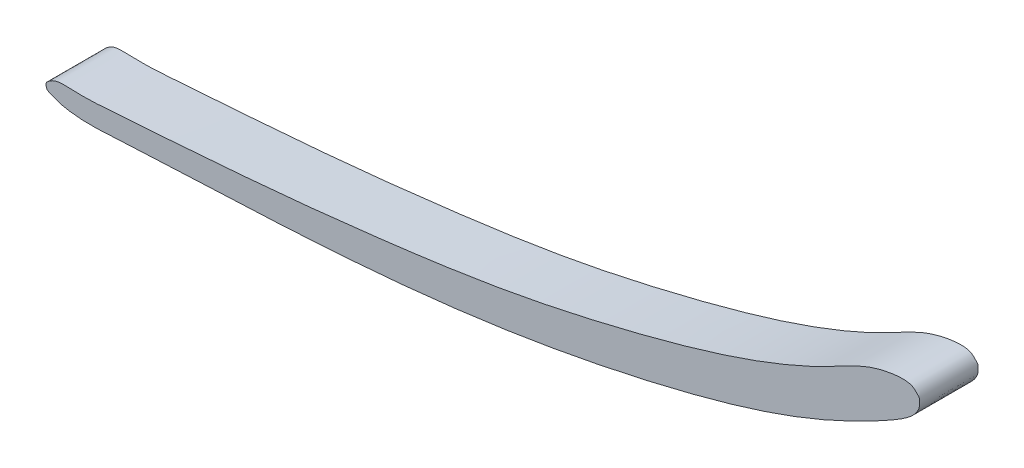
ISO-10303-21;
HEADER;
FILE_DESCRIPTION(('STEP AP214'),'2;1');
FILE_NAME('part.step','',(''),(''),'','','');
FILE_SCHEMA(('AUTOMOTIVE_DESIGN { 1 0 10303 214 1 1 1 1 }'));
ENDSEC;
DATA;
#1=APPLICATION_CONTEXT('core data for automotive mechanical design processes');
#2=APPLICATION_PROTOCOL_DEFINITION('international standard','automotive_design',2000,#1);
#3=PRODUCT_CONTEXT('',#1,'mechanical');
#4=PRODUCT('Part','Part','',(#3));
#5=PRODUCT_RELATED_PRODUCT_CATEGORY('part','',(#4));
#6=PRODUCT_DEFINITION_FORMATION('','',#4);
#7=PRODUCT_DEFINITION_CONTEXT('part definition',#1,'design');
#8=PRODUCT_DEFINITION('design','',#6,#7);
#9=PRODUCT_DEFINITION_SHAPE('','',#8);
#10=(LENGTH_UNIT() NAMED_UNIT(*) SI_UNIT(.MILLI.,.METRE.));
#11=(NAMED_UNIT(*) PLANE_ANGLE_UNIT() SI_UNIT($,.RADIAN.));
#12=(NAMED_UNIT(*) SI_UNIT($,.STERADIAN.) SOLID_ANGLE_UNIT());
#13=UNCERTAINTY_MEASURE_WITH_UNIT(LENGTH_MEASURE(1.E-05),#10,'distance_accuracy_value','');
#14=(GEOMETRIC_REPRESENTATION_CONTEXT(3) GLOBAL_UNCERTAINTY_ASSIGNED_CONTEXT((#13)) GLOBAL_UNIT_ASSIGNED_CONTEXT((#10,
#11,#12)) REPRESENTATION_CONTEXT('',''));
#15=CARTESIAN_POINT('',(0.,0.,0.));
#16=DIRECTION('',(0.,0.,1.));
#17=DIRECTION('',(1.,0.,0.));
#18=AXIS2_PLACEMENT_3D('',#15,#16,#17);
#19=CARTESIAN_POINT('',(65.9642108169921,0.,388.));
#20=CARTESIAN_POINT('',(65.9392604277968,0.0787500690966614,388.));
#21=CARTESIAN_POINT('',(65.8874789664315,0.142846440213562,388.));
#22=CARTESIAN_POINT('',(65.7787320444733,0.264169227618044,388.));
#23=CARTESIAN_POINT('',(65.7207722300646,0.321384266652125,388.));
#24=CARTESIAN_POINT('',(65.5503656062692,0.496366636395962,388.));
#25=CARTESIAN_POINT('',(65.4377078271482,0.615289117925799,388.));
#26=CARTESIAN_POINT('',(65.2517296303627,0.771103452941152,388.));
#27=CARTESIAN_POINT('',(65.1874278544465,0.819707672533615,388.));
#28=CARTESIAN_POINT('',(65.0503069560082,0.904618416811304,388.));
#29=CARTESIAN_POINT('',(64.9772650788789,0.941289962653219,388.));
#30=CARTESIAN_POINT('',(64.7497811757064,1.03476083895088,388.));
#31=CARTESIAN_POINT('',(64.5926836151299,1.07331051921819,388.));
#32=CARTESIAN_POINT('',(64.2731707278348,1.1271865497105,388.));
#33=CARTESIAN_POINT('',(64.1100919216247,1.14193842680402,388.));
#34=CARTESIAN_POINT('',(63.7865768692738,1.15870800268766,388.));
#35=CARTESIAN_POINT('',(63.6252966356052,1.16061833902611,388.));
#36=CARTESIAN_POINT('',(63.1427335001329,1.14901922847191,388.));
#37=CARTESIAN_POINT('',(62.82264224002,1.11934521510709,388.));
#38=CARTESIAN_POINT('',(61.8646438577998,0.999457500857559,388.));
#39=CARTESIAN_POINT('',(61.2275957134184,0.873139458770184,388.));
#40=CARTESIAN_POINT('',(59.9868023955705,0.553958505213503,388.));
#41=CARTESIAN_POINT('',(59.3799039791273,0.358589748207488,388.));
#42=CARTESIAN_POINT('',(57.5974899847509,-0.328984359762002,388.));
#43=CARTESIAN_POINT('',(56.457602278,-0.916521848918717,388.));
#44=CARTESIAN_POINT('',(54.7565709667037,-1.81802494333191,388.));
#45=CARTESIAN_POINT('',(54.1905511029622,-2.12074540468735,388.));
#46=CARTESIAN_POINT('',(53.0525663749559,-2.71286625198194,388.));
#47=CARTESIAN_POINT('',(52.481226933694,-3.00366792990275,388.));
#48=CARTESIAN_POINT('',(50.7544214755258,-3.8474227400587,388.));
#49=CARTESIAN_POINT('',(49.5860213532244,-4.37139635267325,388.));
#50=CARTESIAN_POINT('',(47.2258537122776,-5.36698774035979,388.));
#51=CARTESIAN_POINT('',(46.034288975709,-5.83905985896721,388.));
#52=CARTESIAN_POINT('',(43.634443150405,-6.74575026069812,388.));
#53=CARTESIAN_POINT('',(42.4253581999058,-7.17975742257679,388.));
#54=CARTESIAN_POINT('',(39.99473578518,-8.0060430000595,388.));
#55=CARTESIAN_POINT('',(38.7728594737219,-8.39915359601567,388.));
#56=CARTESIAN_POINT('',(35.0918972791923,-9.53169879542995,388.));
#57=CARTESIAN_POINT('',(32.6200875942023,-10.2266081639388,388.));
#58=CARTESIAN_POINT('',(27.6590940123018,-11.5446994014282,388.));
#59=CARTESIAN_POINT('',(25.1681659412895,-12.1651334390557,388.));
#60=CARTESIAN_POINT('',(20.1696456645858,-13.3403093937647,388.));
#61=CARTESIAN_POINT('',(17.6638962520581,-13.8968119730028,388.));
#62=CARTESIAN_POINT('',(12.6351066276134,-14.9269894733759,388.));
#63=CARTESIAN_POINT('',(10.1106438461161,-15.3978194880559,388.));
#64=CARTESIAN_POINT('',(5.04705965641873,-16.2485879920392,388.));
#65=CARTESIAN_POINT('',(2.50859634852263,-16.6291947143201,388.));
#66=CARTESIAN_POINT('',(-2.57688899399253,-17.3329615389946,388.));
#67=CARTESIAN_POINT('',(-5.12368892729978,-17.6588430807766,388.));
#68=CARTESIAN_POINT('',(-12.7690520579369,-18.5881322254008,388.));
#69=CARTESIAN_POINT('',(-17.8749794132735,-19.1358117771888,388.));
#70=CARTESIAN_POINT('',(-28.1023034658038,-20.0562887004946,388.));
#71=CARTESIAN_POINT('',(-33.2228827851277,-20.4376817382285,388.));
#72=CARTESIAN_POINT('',(-39.6237509954103,-20.9093219874368,388.));
#73=CARTESIAN_POINT('',(-40.9039962840792,-21.002676829007,388.));
#74=CARTESIAN_POINT('',(-42.824766919896,-21.1370946502369,388.));
#75=CARTESIAN_POINT('',(-43.4651186699146,-21.180506652422,388.));
#76=CARTESIAN_POINT('',(-44.7458493129552,-21.2669067002644,388.));
#77=CARTESIAN_POINT('',(-45.3862325038984,-21.3110553944028,388.));
#78=CARTESIAN_POINT('',(-46.6675302142903,-21.3859859680086,388.));
#79=CARTESIAN_POINT('',(-47.3082343394681,-21.4163645469563,388.));
#80=CARTESIAN_POINT('',(-48.2695280474722,-21.4314776101353,388.));
#81=CARTESIAN_POINT('',(-48.5899931851929,-21.4321684250537,388.));
#82=CARTESIAN_POINT('',(-49.2310083883098,-21.422660642521,388.));
#83=CARTESIAN_POINT('',(-49.5515695342703,-21.4110412969346,388.));
#84=CARTESIAN_POINT('',(-50.1927239762963,-21.3836803246825,388.));
#85=CARTESIAN_POINT('',(-50.5135086932717,-21.370385869251,388.));
#86=CARTESIAN_POINT('',(-51.1539205751515,-21.3728740146693,388.));
#87=CARTESIAN_POINT('',(-51.4731612822713,-21.3851335782777,388.));
#88=CARTESIAN_POINT('',(-51.9467576939098,-21.4636044214519,388.));
#89=CARTESIAN_POINT('',(-52.105175905584,-21.5009809380998,388.));
#90=CARTESIAN_POINT('',(-52.4054652955935,-21.6056828948007,388.));
#91=CARTESIAN_POINT('',(-52.5475806572714,-21.6745987471624,388.));
#92=CARTESIAN_POINT('',(-52.819883737945,-21.83703771257,388.));
#93=CARTESIAN_POINT('',(-52.9512682536261,-21.9293075929916,388.));
#94=CARTESIAN_POINT('',(-53.1420580882683,-22.0750081789947,388.));
#95=CARTESIAN_POINT('',(-53.2071720058634,-22.121802219078,388.));
#96=CARTESIAN_POINT('',(-53.2948585143602,-22.2036590247301,388.));
#97=CARTESIAN_POINT('',(-53.3220673665442,-22.2334103186364,388.));
#98=CARTESIAN_POINT('',(-53.3674465063147,-22.3030474090628,388.));
#99=CARTESIAN_POINT('',(-53.3844573084682,-22.3402893587864,388.));
#100=CARTESIAN_POINT('',(-53.4210639936985,-22.4581713600573,388.));
#101=CARTESIAN_POINT('',(-53.4219354782649,-22.542680595509,388.));
#102=CARTESIAN_POINT('',(-53.4032851978629,-22.7061575054446,388.));
#103=CARTESIAN_POINT('',(-53.3901634459533,-22.787192590055,388.));
#104=CARTESIAN_POINT('',(-53.3481176763658,-22.9463351895977,388.));
#105=CARTESIAN_POINT('',(-53.3174422641806,-23.0250371022844,388.));
#106=CARTESIAN_POINT('',(-53.2128913009128,-23.1539721411735,388.));
#107=CARTESIAN_POINT('',(-53.1392758572465,-23.1959191877526,388.));
#108=CARTESIAN_POINT('',(-52.9891963089232,-23.2619574052381,388.));
#109=CARTESIAN_POINT('',(-52.9114871441464,-23.2886399913511,388.));
#110=CARTESIAN_POINT('',(-52.7584537212832,-23.3476663864524,388.));
#111=CARTESIAN_POINT('',(-52.6824893940183,-23.3784715270879,388.));
#112=CARTESIAN_POINT('',(-52.4552152795412,-23.4729355145685,388.));
#113=CARTESIAN_POINT('',(-52.3050351147794,-23.539756873824,388.));
#114=CARTESIAN_POINT('',(-51.8501097024749,-23.7275991417051,388.));
#115=CARTESIAN_POINT('',(-51.5376922777435,-23.8265359973429,388.));
#116=CARTESIAN_POINT('',(-50.8992249330776,-23.9851691203188,388.));
#117=CARTESIAN_POINT('',(-50.5756264503499,-24.0472311719441,388.));
#118=CARTESIAN_POINT('',(-49.6073783965635,-24.2035447785117,388.));
#119=CARTESIAN_POINT('',(-48.9593340099133,-24.2620406718818,388.));
#120=CARTESIAN_POINT('',(-47.6596318360921,-24.3141461601518,388.));
#121=CARTESIAN_POINT('',(-47.0080994304757,-24.3100072477715,388.));
#122=CARTESIAN_POINT('',(-45.7037182013001,-24.2780903364879,388.));
#123=CARTESIAN_POINT('',(-45.0507095812287,-24.248663170275,388.));
#124=CARTESIAN_POINT('',(-43.7458312021009,-24.182566121625,388.));
#125=CARTESIAN_POINT('',(-43.0935952790582,-24.1455760691589,388.));
#126=CARTESIAN_POINT('',(-41.1369581776411,-24.0331975163158,388.));
#127=CARTESIAN_POINT('',(-39.8324949729532,-23.9590588798067,388.));
#128=CARTESIAN_POINT('',(-35.9180997533741,-23.757042369718,388.));
#129=CARTESIAN_POINT('',(-33.3072606674215,-23.6475851612079,388.));
#130=CARTESIAN_POINT('',(-28.0855986870327,-23.4282444992524,388.));
#131=CARTESIAN_POINT('',(-25.4748830123288,-23.316535036285,388.));
#132=CARTESIAN_POINT('',(-17.6458860622312,-22.9257036654572,388.));
#133=CARTESIAN_POINT('',(-12.4295110950171,-22.591215585468,388.));
#134=CARTESIAN_POINT('',(-2.01680300936645,-21.6669805567166,388.));
#135=CARTESIAN_POINT('',(3.1792578141617,-21.0819564507359,388.));
#136=CARTESIAN_POINT('',(13.5246956704272,-19.5881773945117,388.));
#137=CARTESIAN_POINT('',(18.6737714437003,-18.6760127034812,388.));
#138=CARTESIAN_POINT('',(26.3501491609859,-17.0792677310921,388.));
#139=CARTESIAN_POINT('',(28.9002388250499,-16.5104169154326,388.));
#140=CARTESIAN_POINT('',(33.9803763134568,-15.2884237762731,388.));
#141=CARTESIAN_POINT('',(36.5117533185728,-14.6364326828999,388.));
#142=CARTESIAN_POINT('',(41.5413423081267,-13.2132112328842,388.));
#143=CARTESIAN_POINT('',(44.0372903688327,-12.4416906526706,388.));
#144=CARTESIAN_POINT('',(48.9724920757394,-10.7184268489999,388.));
#145=CARTESIAN_POINT('',(51.4071911168036,-9.76394180389986,388.));
#146=CARTESIAN_POINT('',(56.1867315518084,-7.64243805906259,388.));
#147=CARTESIAN_POINT('',(58.5289057440696,-6.47676745576864,388.));
#148=CARTESIAN_POINT('',(61.4033144476391,-4.92102218939242,388.));
#149=CARTESIAN_POINT('',(61.9755573398296,-4.60484101236053,388.));
#150=CARTESIAN_POINT('',(62.822925427624,-4.1117018035465,388.));
#151=CARTESIAN_POINT('',(63.1034353929833,-3.94347540791767,388.));
#152=CARTESIAN_POINT('',(63.6559349386653,-3.59454338285464,388.));
#153=CARTESIAN_POINT('',(63.9282731320078,-3.41469241372927,388.));
#154=CARTESIAN_POINT('',(64.4554233597097,-3.03086272723407,388.));
#155=CARTESIAN_POINT('',(64.7106229543283,-2.82642774874983,388.));
#156=CARTESIAN_POINT('',(65.1877516413519,-2.37589238285399,388.));
#157=CARTESIAN_POINT('',(65.406209750067,-2.13062618732443,388.));
#158=CARTESIAN_POINT('',(65.6839775847032,-1.7246065887864,388.));
#159=CARTESIAN_POINT('',(65.7675452095348,-1.58442769692943,388.));
#160=CARTESIAN_POINT('',(65.9039115038873,-1.28756609085134,388.));
#161=CARTESIAN_POINT('',(65.9573363126952,-1.12825620227153,388.));
#162=CARTESIAN_POINT('',(66.0005625001609,-0.808906264520487,388.));
#163=CARTESIAN_POINT('',(65.9911672667361,-0.646725418918664,388.));
#164=CARTESIAN_POINT('',(65.9816128321958,-0.403820913610242,388.));
#165=CARTESIAN_POINT('',(65.9821578723777,-0.322953588910407,388.));
#166=CARTESIAN_POINT('',(65.984764845854,-0.160965703927929,388.));
#167=CARTESIAN_POINT('',(65.9891612061873,-0.0787500690966336,388.));
#168=CARTESIAN_POINT('',(65.9642108169921,0.,388.));
#169=B_SPLINE_CURVE_WITH_KNOTS('',3,(#19,#20,#21,#22,#23,#24,#25,#26,#27,#28,#29,#30,#31,#32,
#33,#34,#35,#36,#37,#38,#39,#40,#41,#42,#43,#44,#45,#46,#47,#48,#49,#50,#51,#52,#53,#54,#55,#56,
#57,#58,#59,#60,#61,#62,#63,#64,#65,#66,#67,#68,#69,#70,#71,#72,#73,#74,#75,#76,#77,#78,#79,#80,
#81,#82,#83,#84,#85,#86,#87,#88,#89,#90,#91,#92,#93,#94,#95,#96,#97,#98,#99,#100,#101,#102,#103,
#104,#105,#106,#107,#108,#109,#110,#111,#112,#113,#114,#115,#116,#117,#118,#119,#120,#121,#122,
#123,#124,#125,#126,#127,#128,#129,#130,#131,#132,#133,#134,#135,#136,#137,#138,#139,#140,#141,
#142,#143,#144,#145,#146,#147,#148,#149,#150,#151,#152,#153,#154,#155,#156,#157,#158,#159,#160,
#161,#162,#163,#164,#165,#166,#167,#168),.UNSPECIFIED.,.T.,.F.,(4,2,2,2,2,2,2,2,2,2,2,2,2,2,2,2,
2,2,2,2,2,2,2,2,2,2,2,2,2,2,2,2,2,2,2,2,2,2,2,2,2,2,2,2,2,2,2,2,2,2,2,2,2,2,2,2,2,2,2,2,2,2,2,2,
2,2,2,2,2,2,2,2,2,2,4),(0.,0.00097656250000013,0.00195312500000026,0.0039062500000004,
0.00488281250000041,0.00585937500000042,0.00781250000000044,0.00976562500000046,
0.0117187500000005,0.0156250000000003,0.0234375000000001,0.0312499999999998,0.0468749999999993,
0.054687499999999,0.0624999999999987,0.0781249999999981,0.0937499999999975,0.109374999999997,
0.124999999999996,0.156249999999995,0.187499999999994,0.218749999999993,0.249999999999991,
0.28124999999999,0.312499999999989,0.374999999999986,0.437499999999984,0.453124999999983,
0.460937499999983,0.468749999999983,0.476562499999982,0.480468749999982,0.484374999999982,
0.488281249999982,0.492187499999982,0.494140624999982,0.496093749999982,0.498046874999982,
0.499023437499982,0.499511718749982,0.499999999999982,0.500976562499982,0.501953124999982,
0.502929687499982,0.503906249999982,0.504882812499982,0.505859374999982,0.507812499999982,
0.511718749999982,0.515624999999982,0.523437499999982,0.531249999999983,0.539062499999983,
0.546874999999983,0.562499999999984,0.593749999999985,0.624999999999986,0.687499999999988,
0.749999999999991,0.812499999999993,0.843749999999994,0.874999999999995,0.906249999999997,
0.937499999999998,0.968749999999999,0.976562499999999,0.980468749999999,0.984374999999999,
0.98828125,0.9921875,0.994140625,0.99609375,0.998046875,0.9990234375,1.),.UNSPECIFIED.);
#170=DIRECTION('',(0.,0.,-1.));
#171=VECTOR('',#170,1.);
#172=SURFACE_OF_LINEAR_EXTRUSION('',#169,#171);
#173=CARTESIAN_POINT('',(65.9642108169921,0.,388.));
#174=CARTESIAN_POINT('',(65.9891612061873,-0.0787500690966336,388.));
#175=CARTESIAN_POINT('',(65.984764845854,-0.160965703927929,388.));
#176=CARTESIAN_POINT('',(65.9821578723777,-0.322953588910407,388.));
#177=CARTESIAN_POINT('',(65.9816128321958,-0.403820913610242,388.));
#178=CARTESIAN_POINT('',(65.9911672667361,-0.646725418918664,388.));
#179=CARTESIAN_POINT('',(66.0005625001609,-0.808906264520487,388.));
#180=CARTESIAN_POINT('',(65.9573363126952,-1.12825620227153,388.));
#181=CARTESIAN_POINT('',(65.9039115038873,-1.28756609085134,388.));
#182=CARTESIAN_POINT('',(65.7675452095348,-1.58442769692943,388.));
#183=CARTESIAN_POINT('',(65.6839775847032,-1.7246065887864,388.));
#184=CARTESIAN_POINT('',(65.406209750067,-2.13062618732443,388.));
#185=CARTESIAN_POINT('',(65.1877516413519,-2.37589238285399,388.));
#186=CARTESIAN_POINT('',(64.7106229543283,-2.82642774874983,388.));
#187=CARTESIAN_POINT('',(64.4554233597097,-3.03086272723407,388.));
#188=CARTESIAN_POINT('',(63.9282731320078,-3.41469241372927,388.));
#189=CARTESIAN_POINT('',(63.6559349386653,-3.59454338285464,388.));
#190=CARTESIAN_POINT('',(63.1034353929833,-3.94347540791767,388.));
#191=CARTESIAN_POINT('',(62.822925427624,-4.1117018035465,388.));
#192=CARTESIAN_POINT('',(61.9755573398296,-4.60484101236053,388.));
#193=CARTESIAN_POINT('',(61.4033144476391,-4.92102218939242,388.));
#194=CARTESIAN_POINT('',(58.5289057440696,-6.47676745576864,388.));
#195=CARTESIAN_POINT('',(56.1867315518084,-7.64243805906259,388.));
#196=CARTESIAN_POINT('',(51.4071911168036,-9.76394180389986,388.));
#197=CARTESIAN_POINT('',(48.9724920757394,-10.7184268489999,388.));
#198=CARTESIAN_POINT('',(44.0372903688327,-12.4416906526706,388.));
#199=CARTESIAN_POINT('',(41.5413423081267,-13.2132112328842,388.));
#200=CARTESIAN_POINT('',(36.5117533185728,-14.6364326828999,388.));
#201=CARTESIAN_POINT('',(33.9803763134568,-15.2884237762731,388.));
#202=CARTESIAN_POINT('',(28.9002388250499,-16.5104169154326,388.));
#203=CARTESIAN_POINT('',(26.3501491609859,-17.0792677310921,388.));
#204=CARTESIAN_POINT('',(18.6737714437003,-18.6760127034812,388.));
#205=CARTESIAN_POINT('',(13.5246956704272,-19.5881773945117,388.));
#206=CARTESIAN_POINT('',(3.1792578141617,-21.0819564507359,388.));
#207=CARTESIAN_POINT('',(-2.01680300936645,-21.6669805567166,388.));
#208=CARTESIAN_POINT('',(-12.4295110950171,-22.591215585468,388.));
#209=CARTESIAN_POINT('',(-17.6458860622312,-22.9257036654572,388.));
#210=CARTESIAN_POINT('',(-25.4748830123288,-23.316535036285,388.));
#211=CARTESIAN_POINT('',(-28.0855986870327,-23.4282444992524,388.));
#212=CARTESIAN_POINT('',(-33.3072606674215,-23.6475851612079,388.));
#213=CARTESIAN_POINT('',(-35.9180997533741,-23.757042369718,388.));
#214=CARTESIAN_POINT('',(-39.8324949729532,-23.9590588798067,388.));
#215=CARTESIAN_POINT('',(-41.1369581776411,-24.0331975163158,388.));
#216=CARTESIAN_POINT('',(-43.0935952790582,-24.1455760691589,388.));
#217=CARTESIAN_POINT('',(-43.7458312021009,-24.182566121625,388.));
#218=CARTESIAN_POINT('',(-45.0507095812287,-24.248663170275,388.));
#219=CARTESIAN_POINT('',(-45.7037182013001,-24.2780903364879,388.));
#220=CARTESIAN_POINT('',(-47.0080994304757,-24.3100072477715,388.));
#221=CARTESIAN_POINT('',(-47.6596318360921,-24.3141461601518,388.));
#222=CARTESIAN_POINT('',(-48.9593340099133,-24.2620406718818,388.));
#223=CARTESIAN_POINT('',(-49.6073783965635,-24.2035447785117,388.));
#224=CARTESIAN_POINT('',(-50.5756264503499,-24.0472311719441,388.));
#225=CARTESIAN_POINT('',(-50.8992249330776,-23.9851691203188,388.));
#226=CARTESIAN_POINT('',(-51.5376922777435,-23.8265359973429,388.));
#227=CARTESIAN_POINT('',(-51.8501097024749,-23.7275991417051,388.));
#228=CARTESIAN_POINT('',(-52.3050351147794,-23.539756873824,388.));
#229=CARTESIAN_POINT('',(-52.4552152795412,-23.4729355145685,388.));
#230=CARTESIAN_POINT('',(-52.6824893940183,-23.3784715270879,388.));
#231=CARTESIAN_POINT('',(-52.7584537212832,-23.3476663864524,388.));
#232=CARTESIAN_POINT('',(-52.9114871441464,-23.2886399913511,388.));
#233=CARTESIAN_POINT('',(-52.9891963089232,-23.2619574052381,388.));
#234=CARTESIAN_POINT('',(-53.1392758572465,-23.1959191877526,388.));
#235=CARTESIAN_POINT('',(-53.2128913009128,-23.1539721411735,388.));
#236=CARTESIAN_POINT('',(-53.3174422641806,-23.0250371022844,388.));
#237=CARTESIAN_POINT('',(-53.3481176763658,-22.9463351895977,388.));
#238=CARTESIAN_POINT('',(-53.3901634459533,-22.787192590055,388.));
#239=CARTESIAN_POINT('',(-53.4032851978629,-22.7061575054446,388.));
#240=CARTESIAN_POINT('',(-53.4219354782649,-22.542680595509,388.));
#241=CARTESIAN_POINT('',(-53.4210639936985,-22.4581713600573,388.));
#242=CARTESIAN_POINT('',(-53.3844573084682,-22.3402893587864,388.));
#243=CARTESIAN_POINT('',(-53.3674465063147,-22.3030474090628,388.));
#244=CARTESIAN_POINT('',(-53.3220673665442,-22.2334103186364,388.));
#245=CARTESIAN_POINT('',(-53.2948585143602,-22.2036590247301,388.));
#246=CARTESIAN_POINT('',(-53.2071720058634,-22.121802219078,388.));
#247=CARTESIAN_POINT('',(-53.1420580882683,-22.0750081789947,388.));
#248=CARTESIAN_POINT('',(-52.9512682536261,-21.9293075929916,388.));
#249=CARTESIAN_POINT('',(-52.819883737945,-21.83703771257,388.));
#250=CARTESIAN_POINT('',(-52.5475806572714,-21.6745987471624,388.));
#251=CARTESIAN_POINT('',(-52.4054652955935,-21.6056828948007,388.));
#252=CARTESIAN_POINT('',(-52.105175905584,-21.5009809380998,388.));
#253=CARTESIAN_POINT('',(-51.9467576939098,-21.4636044214519,388.));
#254=CARTESIAN_POINT('',(-51.4731612822713,-21.3851335782777,388.));
#255=CARTESIAN_POINT('',(-51.1539205751515,-21.3728740146693,388.));
#256=CARTESIAN_POINT('',(-50.5135086932717,-21.370385869251,388.));
#257=CARTESIAN_POINT('',(-50.1927239762963,-21.3836803246825,388.));
#258=CARTESIAN_POINT('',(-49.5515695342703,-21.4110412969346,388.));
#259=CARTESIAN_POINT('',(-49.2310083883098,-21.422660642521,388.));
#260=CARTESIAN_POINT('',(-48.5899931851929,-21.4321684250537,388.));
#261=CARTESIAN_POINT('',(-48.2695280474722,-21.4314776101353,388.));
#262=CARTESIAN_POINT('',(-47.3082343394681,-21.4163645469563,388.));
#263=CARTESIAN_POINT('',(-46.6675302142903,-21.3859859680086,388.));
#264=CARTESIAN_POINT('',(-45.3862325038984,-21.3110553944028,388.));
#265=CARTESIAN_POINT('',(-44.7458493129552,-21.2669067002644,388.));
#266=CARTESIAN_POINT('',(-43.4651186699146,-21.180506652422,388.));
#267=CARTESIAN_POINT('',(-42.824766919896,-21.1370946502369,388.));
#268=CARTESIAN_POINT('',(-40.9039962840792,-21.002676829007,388.));
#269=CARTESIAN_POINT('',(-39.6237509954103,-20.9093219874368,388.));
#270=CARTESIAN_POINT('',(-33.2228827851277,-20.4376817382285,388.));
#271=CARTESIAN_POINT('',(-28.1023034658038,-20.0562887004946,388.));
#272=CARTESIAN_POINT('',(-17.8749794132735,-19.1358117771888,388.));
#273=CARTESIAN_POINT('',(-12.7690520579369,-18.5881322254008,388.));
#274=CARTESIAN_POINT('',(-5.12368892729978,-17.6588430807766,388.));
#275=CARTESIAN_POINT('',(-2.57688899399253,-17.3329615389946,388.));
#276=CARTESIAN_POINT('',(2.50859634852263,-16.6291947143201,388.));
#277=CARTESIAN_POINT('',(5.04705965641873,-16.2485879920392,388.));
#278=CARTESIAN_POINT('',(10.1106438461161,-15.3978194880559,388.));
#279=CARTESIAN_POINT('',(12.6351066276134,-14.9269894733759,388.));
#280=CARTESIAN_POINT('',(17.6638962520581,-13.8968119730028,388.));
#281=CARTESIAN_POINT('',(20.1696456645858,-13.3403093937647,388.));
#282=CARTESIAN_POINT('',(25.1681659412895,-12.1651334390557,388.));
#283=CARTESIAN_POINT('',(27.6590940123018,-11.5446994014282,388.));
#284=CARTESIAN_POINT('',(32.6200875942023,-10.2266081639388,388.));
#285=CARTESIAN_POINT('',(35.0918972791923,-9.53169879542995,388.));
#286=CARTESIAN_POINT('',(38.7728594737219,-8.39915359601567,388.));
#287=CARTESIAN_POINT('',(39.99473578518,-8.0060430000595,388.));
#288=CARTESIAN_POINT('',(42.4253581999058,-7.17975742257679,388.));
#289=CARTESIAN_POINT('',(43.634443150405,-6.74575026069812,388.));
#290=CARTESIAN_POINT('',(46.034288975709,-5.83905985896721,388.));
#291=CARTESIAN_POINT('',(47.2258537122776,-5.36698774035979,388.));
#292=CARTESIAN_POINT('',(49.5860213532244,-4.37139635267325,388.));
#293=CARTESIAN_POINT('',(50.7544214755258,-3.8474227400587,388.));
#294=CARTESIAN_POINT('',(52.481226933694,-3.00366792990275,388.));
#295=CARTESIAN_POINT('',(53.0525663749559,-2.71286625198194,388.));
#296=CARTESIAN_POINT('',(54.1905511029622,-2.12074540468735,388.));
#297=CARTESIAN_POINT('',(54.7565709667037,-1.81802494333191,388.));
#298=CARTESIAN_POINT('',(56.457602278,-0.916521848918717,388.));
#299=CARTESIAN_POINT('',(57.5974899847509,-0.328984359762002,388.));
#300=CARTESIAN_POINT('',(59.3799039791273,0.358589748207488,388.));
#301=CARTESIAN_POINT('',(59.9868023955705,0.553958505213503,388.));
#302=CARTESIAN_POINT('',(61.2275957134184,0.873139458770184,388.));
#303=CARTESIAN_POINT('',(61.8646438577998,0.999457500857559,388.));
#304=CARTESIAN_POINT('',(62.82264224002,1.11934521510709,388.));
#305=CARTESIAN_POINT('',(63.1427335001329,1.14901922847191,388.));
#306=CARTESIAN_POINT('',(63.6252966356052,1.16061833902611,388.));
#307=CARTESIAN_POINT('',(63.7865768692738,1.15870800268766,388.));
#308=CARTESIAN_POINT('',(64.1100919216247,1.14193842680402,388.));
#309=CARTESIAN_POINT('',(64.2731707278348,1.1271865497105,388.));
#310=CARTESIAN_POINT('',(64.5926836151299,1.07331051921819,388.));
#311=CARTESIAN_POINT('',(64.7497811757064,1.03476083895088,388.));
#312=CARTESIAN_POINT('',(64.9772650788789,0.941289962653219,388.));
#313=CARTESIAN_POINT('',(65.0503069560082,0.904618416811304,388.));
#314=CARTESIAN_POINT('',(65.1874278544465,0.819707672533615,388.));
#315=CARTESIAN_POINT('',(65.2517296303627,0.771103452941152,388.));
#316=CARTESIAN_POINT('',(65.4377078271482,0.615289117925799,388.));
#317=CARTESIAN_POINT('',(65.5503656062692,0.496366636395962,388.));
#318=CARTESIAN_POINT('',(65.7207722300646,0.321384266652125,388.));
#319=CARTESIAN_POINT('',(65.7787320444733,0.264169227618044,388.));
#320=CARTESIAN_POINT('',(65.8874789664315,0.142846440213562,388.));
#321=CARTESIAN_POINT('',(65.9392604277968,0.0787500690966614,388.));
#322=CARTESIAN_POINT('',(65.9642108169921,0.,388.));
#323=B_SPLINE_CURVE_WITH_KNOTS('',3,(#173,#174,#175,#176,#177,#178,#179,#180,#181,#182,#183,
#184,#185,#186,#187,#188,#189,#190,#191,#192,#193,#194,#195,#196,#197,#198,#199,#200,#201,#202,
#203,#204,#205,#206,#207,#208,#209,#210,#211,#212,#213,#214,#215,#216,#217,#218,#219,#220,#221,
#222,#223,#224,#225,#226,#227,#228,#229,#230,#231,#232,#233,#234,#235,#236,#237,#238,#239,#240,
#241,#242,#243,#244,#245,#246,#247,#248,#249,#250,#251,#252,#253,#254,#255,#256,#257,#258,#259,
#260,#261,#262,#263,#264,#265,#266,#267,#268,#269,#270,#271,#272,#273,#274,#275,#276,#277,#278,
#279,#280,#281,#282,#283,#284,#285,#286,#287,#288,#289,#290,#291,#292,#293,#294,#295,#296,#297,
#298,#299,#300,#301,#302,#303,#304,#305,#306,#307,#308,#309,#310,#311,#312,#313,#314,#315,#316,
#317,#318,#319,#320,#321,#322),.UNSPECIFIED.,.T.,.F.,(4,2,2,2,2,2,2,2,2,2,2,2,2,2,2,2,2,2,2,2,2,
2,2,2,2,2,2,2,2,2,2,2,2,2,2,2,2,2,2,2,2,2,2,2,2,2,2,2,2,2,2,2,2,2,2,2,2,2,2,2,2,2,2,2,2,2,2,2,2,
2,2,2,2,2,4),(0.,0.0009765625,0.001953125,0.00390625000000011,0.00585937500000011,
0.00781250000000011,0.0117187500000003,0.0156250000000006,0.0195312500000007,0.0234375000000009,
0.0312500000000011,0.0625000000000023,0.0937500000000034,0.125000000000005,0.156250000000006,
0.187500000000007,0.250000000000009,0.312500000000012,0.375000000000014,0.406250000000015,
0.437500000000016,0.453125000000017,0.460937500000017,0.468750000000017,0.476562500000018,
0.484375000000018,0.488281250000018,0.492187500000018,0.494140625000018,0.495117187500018,
0.496093750000018,0.497070312500018,0.498046875000018,0.499023437500018,0.500000000000018,
0.500488281250018,0.500976562500018,0.501953125000018,0.503906250000018,0.505859375000018,
0.507812500000018,0.511718750000018,0.515625000000018,0.519531250000018,0.523437500000018,
0.531250000000017,0.539062500000017,0.546875000000017,0.562500000000016,0.625000000000014,
0.687500000000011,0.71875000000001,0.750000000000009,0.781250000000007,0.812500000000006,
0.843750000000005,0.875000000000004,0.890625000000003,0.906250000000003,0.921875000000002,
0.937500000000001,0.945312500000001,0.953125000000001,0.96875,0.9765625,0.984375,0.98828125,
0.990234375,0.9921875,0.994140625,0.9951171875,0.99609375,0.998046875,0.9990234375,1.),.UNSPECIFIED.);
#324=CARTESIAN_POINT('',(65.9642108169921,0.,388.));
#325=VERTEX_POINT('',#324);
#326=EDGE_CURVE('E10',#325,#325,#323,.F.);
#327=ORIENTED_EDGE('',*,*,#326,.F.);
#328=EDGE_LOOP('',(#327));
#329=FACE_BOUND('',#328,.T.);
#330=CARTESIAN_POINT('',(65.9642108169921,0.,380.000000000001));
#331=CARTESIAN_POINT('',(65.9392604277968,0.0787500690966614,380.000000000001));
#332=CARTESIAN_POINT('',(65.8874789664315,0.142846440213562,380.000000000001));
#333=CARTESIAN_POINT('',(65.7787320444733,0.264169227618044,380.000000000001));
#334=CARTESIAN_POINT('',(65.7207722300646,0.321384266652125,380.000000000001));
#335=CARTESIAN_POINT('',(65.5503656062692,0.496366636395962,380.000000000001));
#336=CARTESIAN_POINT('',(65.4377078271482,0.615289117925799,380.000000000001));
#337=CARTESIAN_POINT('',(65.2517296303627,0.771103452941152,380.000000000001));
#338=CARTESIAN_POINT('',(65.1874278544465,0.819707672533615,380.000000000001));
#339=CARTESIAN_POINT('',(65.0503069560082,0.904618416811304,380.000000000001));
#340=CARTESIAN_POINT('',(64.9772650788789,0.941289962653219,380.000000000001));
#341=CARTESIAN_POINT('',(64.7497811757064,1.03476083895088,380.000000000001));
#342=CARTESIAN_POINT('',(64.5926836151299,1.07331051921819,380.000000000001));
#343=CARTESIAN_POINT('',(64.2731707278348,1.1271865497105,380.000000000001));
#344=CARTESIAN_POINT('',(64.1100919216247,1.14193842680402,380.000000000001));
#345=CARTESIAN_POINT('',(63.7865768692738,1.15870800268766,380.000000000001));
#346=CARTESIAN_POINT('',(63.6252966356052,1.16061833902611,380.000000000001));
#347=CARTESIAN_POINT('',(63.1427335001329,1.14901922847191,380.000000000001));
#348=CARTESIAN_POINT('',(62.82264224002,1.11934521510709,380.000000000001));
#349=CARTESIAN_POINT('',(61.8646438577998,0.999457500857559,380.000000000001));
#350=CARTESIAN_POINT('',(61.2275957134184,0.873139458770184,380.000000000001));
#351=CARTESIAN_POINT('',(59.9868023955705,0.553958505213503,380.000000000001));
#352=CARTESIAN_POINT('',(59.3799039791273,0.358589748207488,380.000000000001));
#353=CARTESIAN_POINT('',(57.5974899847509,-0.328984359762002,380.000000000001));
#354=CARTESIAN_POINT('',(56.457602278,-0.916521848918717,380.000000000001));
#355=CARTESIAN_POINT('',(54.7565709667037,-1.81802494333191,380.000000000001));
#356=CARTESIAN_POINT('',(54.1905511029622,-2.12074540468735,380.000000000001));
#357=CARTESIAN_POINT('',(53.0525663749559,-2.71286625198194,380.000000000001));
#358=CARTESIAN_POINT('',(52.481226933694,-3.00366792990275,380.000000000001));
#359=CARTESIAN_POINT('',(50.7544214755258,-3.8474227400587,380.000000000001));
#360=CARTESIAN_POINT('',(49.5860213532244,-4.37139635267325,380.000000000001));
#361=CARTESIAN_POINT('',(47.2258537122776,-5.36698774035979,380.000000000001));
#362=CARTESIAN_POINT('',(46.034288975709,-5.83905985896721,380.000000000001));
#363=CARTESIAN_POINT('',(43.634443150405,-6.74575026069812,380.000000000001));
#364=CARTESIAN_POINT('',(42.4253581999058,-7.17975742257679,380.000000000001));
#365=CARTESIAN_POINT('',(39.99473578518,-8.0060430000595,380.000000000001));
#366=CARTESIAN_POINT('',(38.7728594737219,-8.39915359601567,380.000000000001));
#367=CARTESIAN_POINT('',(35.0918972791923,-9.53169879542995,380.000000000001));
#368=CARTESIAN_POINT('',(32.6200875942023,-10.2266081639388,380.000000000001));
#369=CARTESIAN_POINT('',(27.6590940123018,-11.5446994014282,380.000000000001));
#370=CARTESIAN_POINT('',(25.1681659412895,-12.1651334390557,380.000000000001));
#371=CARTESIAN_POINT('',(20.1696456645858,-13.3403093937647,380.000000000001));
#372=CARTESIAN_POINT('',(17.6638962520581,-13.8968119730028,380.000000000001));
#373=CARTESIAN_POINT('',(12.6351066276134,-14.9269894733759,380.000000000001));
#374=CARTESIAN_POINT('',(10.1106438461161,-15.3978194880559,380.000000000001));
#375=CARTESIAN_POINT('',(5.04705965641873,-16.2485879920392,380.000000000001));
#376=CARTESIAN_POINT('',(2.50859634852263,-16.6291947143201,380.000000000001));
#377=CARTESIAN_POINT('',(-2.57688899399253,-17.3329615389946,380.000000000001));
#378=CARTESIAN_POINT('',(-5.12368892729978,-17.6588430807766,380.000000000001));
#379=CARTESIAN_POINT('',(-12.7690520579369,-18.5881322254008,380.000000000001));
#380=CARTESIAN_POINT('',(-17.8749794132735,-19.1358117771888,380.000000000001));
#381=CARTESIAN_POINT('',(-28.1023034658038,-20.0562887004946,380.000000000001));
#382=CARTESIAN_POINT('',(-33.2228827851277,-20.4376817382285,380.000000000001));
#383=CARTESIAN_POINT('',(-39.6237509954103,-20.9093219874368,380.000000000001));
#384=CARTESIAN_POINT('',(-40.9039962840792,-21.002676829007,380.000000000001));
#385=CARTESIAN_POINT('',(-42.824766919896,-21.1370946502369,380.000000000001));
#386=CARTESIAN_POINT('',(-43.4651186699146,-21.180506652422,380.000000000001));
#387=CARTESIAN_POINT('',(-44.7458493129552,-21.2669067002644,380.000000000001));
#388=CARTESIAN_POINT('',(-45.3862325038984,-21.3110553944028,380.000000000001));
#389=CARTESIAN_POINT('',(-46.6675302142903,-21.3859859680086,380.000000000001));
#390=CARTESIAN_POINT('',(-47.3082343394681,-21.4163645469563,380.000000000001));
#391=CARTESIAN_POINT('',(-48.2695280474722,-21.4314776101353,380.000000000001));
#392=CARTESIAN_POINT('',(-48.5899931851929,-21.4321684250537,380.000000000001));
#393=CARTESIAN_POINT('',(-49.2310083883098,-21.422660642521,380.000000000001));
#394=CARTESIAN_POINT('',(-49.5515695342703,-21.4110412969346,380.000000000001));
#395=CARTESIAN_POINT('',(-50.1927239762963,-21.3836803246825,380.000000000001));
#396=CARTESIAN_POINT('',(-50.5135086932717,-21.370385869251,380.000000000001));
#397=CARTESIAN_POINT('',(-51.1539205751515,-21.3728740146693,380.000000000001));
#398=CARTESIAN_POINT('',(-51.4731612822713,-21.3851335782777,380.000000000001));
#399=CARTESIAN_POINT('',(-51.9467576939098,-21.4636044214519,380.000000000001));
#400=CARTESIAN_POINT('',(-52.105175905584,-21.5009809380998,380.000000000001));
#401=CARTESIAN_POINT('',(-52.4054652955935,-21.6056828948007,380.000000000001));
#402=CARTESIAN_POINT('',(-52.5475806572714,-21.6745987471624,380.000000000001));
#403=CARTESIAN_POINT('',(-52.819883737945,-21.83703771257,380.000000000001));
#404=CARTESIAN_POINT('',(-52.9512682536261,-21.9293075929916,380.000000000001));
#405=CARTESIAN_POINT('',(-53.1420580882683,-22.0750081789947,380.000000000001));
#406=CARTESIAN_POINT('',(-53.2071720058634,-22.121802219078,380.000000000001));
#407=CARTESIAN_POINT('',(-53.2948585143602,-22.2036590247301,380.000000000001));
#408=CARTESIAN_POINT('',(-53.3220673665442,-22.2334103186364,380.000000000001));
#409=CARTESIAN_POINT('',(-53.3674465063147,-22.3030474090628,380.000000000001));
#410=CARTESIAN_POINT('',(-53.3844573084682,-22.3402893587864,380.000000000001));
#411=CARTESIAN_POINT('',(-53.4210639936985,-22.4581713600573,380.000000000001));
#412=CARTESIAN_POINT('',(-53.4219354782649,-22.542680595509,380.000000000001));
#413=CARTESIAN_POINT('',(-53.4032851978629,-22.7061575054446,380.000000000001));
#414=CARTESIAN_POINT('',(-53.3901634459533,-22.787192590055,380.000000000001));
#415=CARTESIAN_POINT('',(-53.3481176763658,-22.9463351895977,380.000000000001));
#416=CARTESIAN_POINT('',(-53.3174422641806,-23.0250371022844,380.000000000001));
#417=CARTESIAN_POINT('',(-53.2128913009128,-23.1539721411735,380.000000000001));
#418=CARTESIAN_POINT('',(-53.1392758572465,-23.1959191877526,380.000000000001));
#419=CARTESIAN_POINT('',(-52.9891963089232,-23.2619574052381,380.000000000001));
#420=CARTESIAN_POINT('',(-52.9114871441464,-23.2886399913511,380.000000000001));
#421=CARTESIAN_POINT('',(-52.7584537212832,-23.3476663864524,380.000000000001));
#422=CARTESIAN_POINT('',(-52.6824893940183,-23.3784715270879,380.000000000001));
#423=CARTESIAN_POINT('',(-52.4552152795412,-23.4729355145685,380.000000000001));
#424=CARTESIAN_POINT('',(-52.3050351147794,-23.539756873824,380.000000000001));
#425=CARTESIAN_POINT('',(-51.8501097024749,-23.7275991417051,380.000000000001));
#426=CARTESIAN_POINT('',(-51.5376922777435,-23.8265359973429,380.000000000001));
#427=CARTESIAN_POINT('',(-50.8992249330776,-23.9851691203188,380.000000000001));
#428=CARTESIAN_POINT('',(-50.5756264503499,-24.0472311719441,380.000000000001));
#429=CARTESIAN_POINT('',(-49.6073783965635,-24.2035447785117,380.000000000001));
#430=CARTESIAN_POINT('',(-48.9593340099133,-24.2620406718818,380.000000000001));
#431=CARTESIAN_POINT('',(-47.6596318360921,-24.3141461601518,380.000000000001));
#432=CARTESIAN_POINT('',(-47.0080994304757,-24.3100072477715,380.000000000001));
#433=CARTESIAN_POINT('',(-45.7037182013001,-24.2780903364879,380.000000000001));
#434=CARTESIAN_POINT('',(-45.0507095812287,-24.248663170275,380.000000000001));
#435=CARTESIAN_POINT('',(-43.7458312021009,-24.182566121625,380.000000000001));
#436=CARTESIAN_POINT('',(-43.0935952790582,-24.1455760691589,380.000000000001));
#437=CARTESIAN_POINT('',(-41.1369581776411,-24.0331975163158,380.000000000001));
#438=CARTESIAN_POINT('',(-39.8324949729532,-23.9590588798067,380.000000000001));
#439=CARTESIAN_POINT('',(-35.9180997533741,-23.757042369718,380.000000000001));
#440=CARTESIAN_POINT('',(-33.3072606674215,-23.6475851612079,380.000000000001));
#441=CARTESIAN_POINT('',(-28.0855986870327,-23.4282444992524,380.000000000001));
#442=CARTESIAN_POINT('',(-25.4748830123288,-23.316535036285,380.000000000001));
#443=CARTESIAN_POINT('',(-17.6458860622312,-22.9257036654572,380.000000000001));
#444=CARTESIAN_POINT('',(-12.4295110950171,-22.591215585468,380.000000000001));
#445=CARTESIAN_POINT('',(-2.01680300936645,-21.6669805567166,380.000000000001));
#446=CARTESIAN_POINT('',(3.1792578141617,-21.0819564507359,380.000000000001));
#447=CARTESIAN_POINT('',(13.5246956704272,-19.5881773945117,380.000000000001));
#448=CARTESIAN_POINT('',(18.6737714437003,-18.6760127034812,380.000000000001));
#449=CARTESIAN_POINT('',(26.3501491609859,-17.0792677310921,380.000000000001));
#450=CARTESIAN_POINT('',(28.9002388250499,-16.5104169154326,380.000000000001));
#451=CARTESIAN_POINT('',(33.9803763134568,-15.2884237762731,380.000000000001));
#452=CARTESIAN_POINT('',(36.5117533185728,-14.6364326828999,380.000000000001));
#453=CARTESIAN_POINT('',(41.5413423081267,-13.2132112328842,380.000000000001));
#454=CARTESIAN_POINT('',(44.0372903688327,-12.4416906526706,380.000000000001));
#455=CARTESIAN_POINT('',(48.9724920757394,-10.7184268489999,380.000000000001));
#456=CARTESIAN_POINT('',(51.4071911168036,-9.76394180389986,380.000000000001));
#457=CARTESIAN_POINT('',(56.1867315518084,-7.64243805906259,380.000000000001));
#458=CARTESIAN_POINT('',(58.5289057440696,-6.47676745576864,380.000000000001));
#459=CARTESIAN_POINT('',(61.4033144476391,-4.92102218939242,380.000000000001));
#460=CARTESIAN_POINT('',(61.9755573398296,-4.60484101236053,380.000000000001));
#461=CARTESIAN_POINT('',(62.822925427624,-4.1117018035465,380.000000000001));
#462=CARTESIAN_POINT('',(63.1034353929833,-3.94347540791767,380.000000000001));
#463=CARTESIAN_POINT('',(63.6559349386653,-3.59454338285464,380.000000000001));
#464=CARTESIAN_POINT('',(63.9282731320078,-3.41469241372927,380.000000000001));
#465=CARTESIAN_POINT('',(64.4554233597097,-3.03086272723407,380.000000000001));
#466=CARTESIAN_POINT('',(64.7106229543283,-2.82642774874983,380.000000000001));
#467=CARTESIAN_POINT('',(65.1877516413519,-2.37589238285399,380.000000000001));
#468=CARTESIAN_POINT('',(65.406209750067,-2.13062618732443,380.000000000001));
#469=CARTESIAN_POINT('',(65.6839775847032,-1.7246065887864,380.000000000001));
#470=CARTESIAN_POINT('',(65.7675452095348,-1.58442769692943,380.000000000001));
#471=CARTESIAN_POINT('',(65.9039115038873,-1.28756609085134,380.000000000001));
#472=CARTESIAN_POINT('',(65.9573363126952,-1.12825620227153,380.000000000001));
#473=CARTESIAN_POINT('',(66.0005625001609,-0.808906264520487,380.000000000001));
#474=CARTESIAN_POINT('',(65.9911672667361,-0.646725418918664,380.000000000001));
#475=CARTESIAN_POINT('',(65.9816128321958,-0.403820913610242,380.000000000001));
#476=CARTESIAN_POINT('',(65.9821578723777,-0.322953588910407,380.000000000001));
#477=CARTESIAN_POINT('',(65.984764845854,-0.160965703927929,380.000000000001));
#478=CARTESIAN_POINT('',(65.9891612061873,-0.0787500690966336,380.000000000001));
#479=CARTESIAN_POINT('',(65.9642108169921,0.,380.000000000001));
#480=B_SPLINE_CURVE_WITH_KNOTS('',3,(#330,#331,#332,#333,#334,#335,#336,#337,#338,#339,#340,
#341,#342,#343,#344,#345,#346,#347,#348,#349,#350,#351,#352,#353,#354,#355,#356,#357,#358,#359,
#360,#361,#362,#363,#364,#365,#366,#367,#368,#369,#370,#371,#372,#373,#374,#375,#376,#377,#378,
#379,#380,#381,#382,#383,#384,#385,#386,#387,#388,#389,#390,#391,#392,#393,#394,#395,#396,#397,
#398,#399,#400,#401,#402,#403,#404,#405,#406,#407,#408,#409,#410,#411,#412,#413,#414,#415,#416,
#417,#418,#419,#420,#421,#422,#423,#424,#425,#426,#427,#428,#429,#430,#431,#432,#433,#434,#435,
#436,#437,#438,#439,#440,#441,#442,#443,#444,#445,#446,#447,#448,#449,#450,#451,#452,#453,#454,
#455,#456,#457,#458,#459,#460,#461,#462,#463,#464,#465,#466,#467,#468,#469,#470,#471,#472,#473,
#474,#475,#476,#477,#478,#479),.UNSPECIFIED.,.T.,.F.,(4,2,2,2,2,2,2,2,2,2,2,2,2,2,2,2,2,2,2,2,2,
2,2,2,2,2,2,2,2,2,2,2,2,2,2,2,2,2,2,2,2,2,2,2,2,2,2,2,2,2,2,2,2,2,2,2,2,2,2,2,2,2,2,2,2,2,2,2,2,
2,2,2,2,2,4),(0.,0.00097656250000013,0.00195312500000026,0.0039062500000004,0.00488281250000041,
0.00585937500000042,0.00781250000000044,0.00976562500000046,0.0117187500000005,
0.0156250000000003,0.0234375000000001,0.0312499999999998,0.0468749999999993,0.054687499999999,
0.0624999999999987,0.0781249999999981,0.0937499999999975,0.109374999999997,0.124999999999996,
0.156249999999995,0.187499999999994,0.218749999999993,0.249999999999991,0.28124999999999,
0.312499999999989,0.374999999999986,0.437499999999984,0.453124999999983,0.460937499999983,
0.468749999999983,0.476562499999982,0.480468749999982,0.484374999999982,0.488281249999982,
0.492187499999982,0.494140624999982,0.496093749999982,0.498046874999982,0.499023437499982,
0.499511718749982,0.499999999999982,0.500976562499982,0.501953124999982,0.502929687499982,
0.503906249999982,0.504882812499982,0.505859374999982,0.507812499999982,0.511718749999982,
0.515624999999982,0.523437499999982,0.531249999999983,0.539062499999983,0.546874999999983,
0.562499999999984,0.593749999999985,0.624999999999986,0.687499999999988,0.749999999999991,
0.812499999999993,0.843749999999994,0.874999999999995,0.906249999999997,0.937499999999998,
0.968749999999999,0.976562499999999,0.980468749999999,0.984374999999999,0.98828125,0.9921875,
0.994140625,0.99609375,0.998046875,0.9990234375,1.),.UNSPECIFIED.);
#481=CARTESIAN_POINT('',(65.9642108169921,0.,380.000000000001));
#482=VERTEX_POINT('',#481);
#483=EDGE_CURVE('E38',#482,#482,#480,.T.);
#484=ORIENTED_EDGE('',*,*,#483,.T.);
#485=EDGE_LOOP('',(#484));
#486=FACE_BOUND('',#485,.T.);
#487=ADVANCED_FACE('F28',(#329,#486),#172,.F.);
#488=CARTESIAN_POINT('',(-53.3966595368797,-22.3795833592144,388.));
#489=DIRECTION('',(0.,0.,-1.));
#490=DIRECTION('',(-1.,0.,0.));
#491=AXIS2_PLACEMENT_3D('',#488,#489,#490);
#492=PLANE('',#491);
#493=ORIENTED_EDGE('',*,*,#326,.T.);
#494=EDGE_LOOP('',(#493));
#495=FACE_BOUND('',#494,.T.);
#496=ADVANCED_FACE('F69',(#495),#492,.F.);
#497=CARTESIAN_POINT('',(-53.3966595368797,-22.3795833592144,380.));
#498=DIRECTION('',(0.,0.,-1.));
#499=DIRECTION('',(-1.,0.,0.));
#500=AXIS2_PLACEMENT_3D('',#497,#498,#499);
#501=PLANE('',#500);
#502=ORIENTED_EDGE('',*,*,#483,.F.);
#503=EDGE_LOOP('',(#502));
#504=FACE_BOUND('',#503,.T.);
#505=ADVANCED_FACE('F77',(#504),#501,.T.);
#506=CLOSED_SHELL('',(#487,#496,#505));
#507=MANIFOLD_SOLID_BREP('B2',#506);
#508=ADVANCED_BREP_SHAPE_REPRESENTATION('',(#18,#507),#14);
#509=SHAPE_DEFINITION_REPRESENTATION(#9,#508);
ENDSEC;
END-ISO-10303-21;
